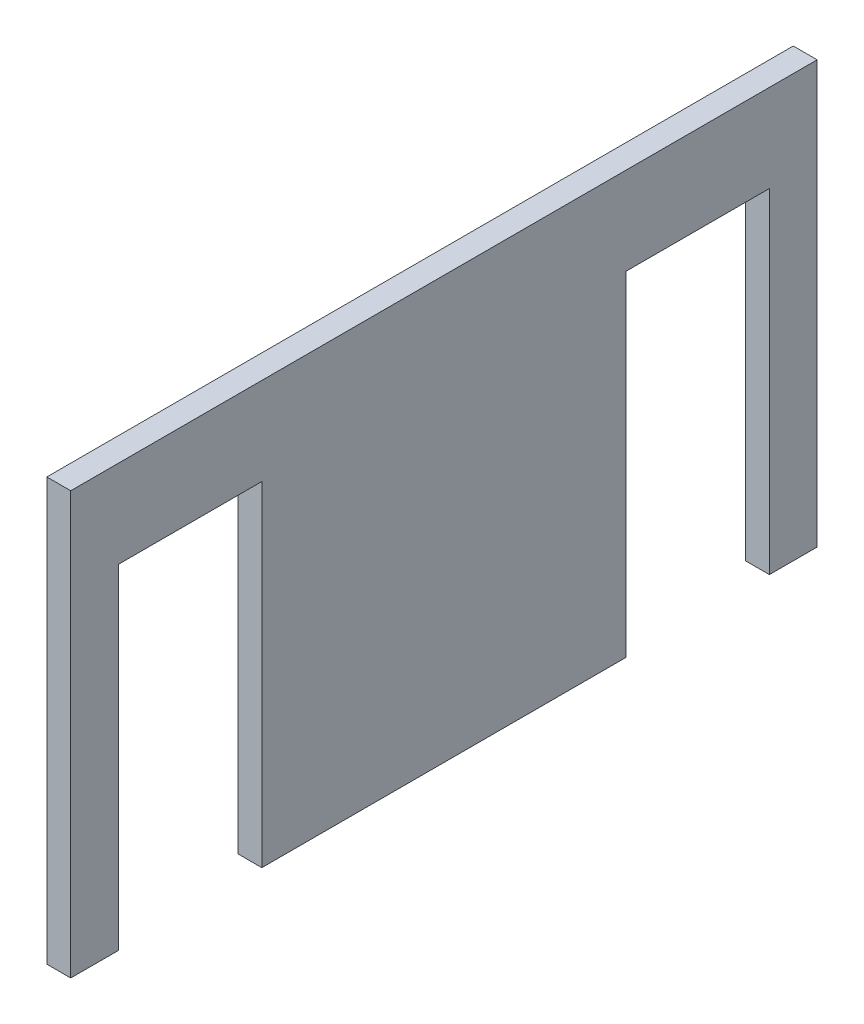
ISO-10303-21;
HEADER;
FILE_DESCRIPTION(('STEP AP214'),'2;1');
FILE_NAME('part.step','',(''),(''),'','','');
FILE_SCHEMA(('AUTOMOTIVE_DESIGN { 1 0 10303 214 1 1 1 1 }'));
ENDSEC;
DATA;
#1=APPLICATION_CONTEXT('core data for automotive mechanical design processes');
#2=APPLICATION_PROTOCOL_DEFINITION('international standard','automotive_design',2000,#1);
#3=PRODUCT_CONTEXT('',#1,'mechanical');
#4=PRODUCT('Part','Part','',(#3));
#5=PRODUCT_RELATED_PRODUCT_CATEGORY('part','',(#4));
#6=PRODUCT_DEFINITION_FORMATION('','',#4);
#7=PRODUCT_DEFINITION_CONTEXT('part definition',#1,'design');
#8=PRODUCT_DEFINITION('design','',#6,#7);
#9=PRODUCT_DEFINITION_SHAPE('','',#8);
#10=(LENGTH_UNIT() NAMED_UNIT(*) SI_UNIT(.MILLI.,.METRE.));
#11=(NAMED_UNIT(*) PLANE_ANGLE_UNIT() SI_UNIT($,.RADIAN.));
#12=(NAMED_UNIT(*) SI_UNIT($,.STERADIAN.) SOLID_ANGLE_UNIT());
#13=UNCERTAINTY_MEASURE_WITH_UNIT(LENGTH_MEASURE(1.E-05),#10,'distance_accuracy_value','');
#14=(GEOMETRIC_REPRESENTATION_CONTEXT(3) GLOBAL_UNCERTAINTY_ASSIGNED_CONTEXT((#13)) GLOBAL_UNIT_ASSIGNED_CONTEXT((#10,
#11,#12)) REPRESENTATION_CONTEXT('',''));
#15=CARTESIAN_POINT('',(0.,0.,0.));
#16=DIRECTION('',(0.,0.,1.));
#17=DIRECTION('',(1.,0.,0.));
#18=AXIS2_PLACEMENT_3D('',#15,#16,#17);
#19=CARTESIAN_POINT('',(0.,0.,0.));
#20=DIRECTION('',(0.,-1.,0.));
#21=DIRECTION('',(0.,0.,-1.));
#22=AXIS2_PLACEMENT_3D('',#19,#20,#21);
#23=PLANE('',#22);
#24=DIRECTION('',(0.,0.,1.));
#25=VECTOR('',#24,1.);
#26=CARTESIAN_POINT('',(-76.2000000000003,0.,2381.25));
#27=LINE('',#26,#25);
#28=CARTESIAN_POINT('',(-76.2000000000003,0.,-1162.05));
#29=VERTEX_POINT('',#28);
#30=CARTESIAN_POINT('',(-76.2000000000003,0.,1162.05));
#31=VERTEX_POINT('',#30);
#32=EDGE_CURVE('E142',#29,#31,#27,.T.);
#33=ORIENTED_EDGE('',*,*,#32,.F.);
#34=DIRECTION('',(1.,0.,0.));
#35=VECTOR('',#34,1.);
#36=CARTESIAN_POINT('',(-76.2000000000003,0.,-1162.05));
#37=LINE('',#36,#35);
#38=CARTESIAN_POINT('',(76.1999999999998,0.,-1162.05));
#39=VERTEX_POINT('',#38);
#40=EDGE_CURVE('E123',#29,#39,#37,.T.);
#41=ORIENTED_EDGE('',*,*,#40,.T.);
#42=DIRECTION('',(0.,0.,-1.));
#43=VECTOR('',#42,1.);
#44=CARTESIAN_POINT('',(76.1999999999998,0.,2381.25));
#45=LINE('',#44,#43);
#46=CARTESIAN_POINT('',(76.1999999999998,0.,1162.05));
#47=VERTEX_POINT('',#46);
#48=EDGE_CURVE('E215',#47,#39,#45,.T.);
#49=ORIENTED_EDGE('',*,*,#48,.F.);
#50=DIRECTION('',(1.,0.,0.));
#51=VECTOR('',#50,1.);
#52=CARTESIAN_POINT('',(-76.2000000000003,0.,1162.05));
#53=LINE('',#52,#51);
#54=EDGE_CURVE('E149',#31,#47,#53,.T.);
#55=ORIENTED_EDGE('',*,*,#54,.F.);
#56=EDGE_LOOP('',(#33,#41,#49,#55));
#57=FACE_BOUND('',#56,.T.);
#58=ADVANCED_FACE('F35',(#57),#23,.T.);
#59=CARTESIAN_POINT('',(76.1999999999998,0.,-2076.45));
#60=VERTEX_POINT('',#59);
#61=CARTESIAN_POINT('',(76.1999999999998,0.,-2381.25));
#62=VERTEX_POINT('',#61);
#63=EDGE_CURVE('E179',#60,#62,#45,.T.);
#64=ORIENTED_EDGE('',*,*,#63,.F.);
#65=DIRECTION('',(1.,0.,0.));
#66=VECTOR('',#65,1.);
#67=CARTESIAN_POINT('',(-76.2000000000003,0.,-2076.45));
#68=LINE('',#67,#66);
#69=CARTESIAN_POINT('',(-76.2000000000003,0.,-2076.45));
#70=VERTEX_POINT('',#69);
#71=EDGE_CURVE('E135',#70,#60,#68,.T.);
#72=ORIENTED_EDGE('',*,*,#71,.F.);
#73=CARTESIAN_POINT('',(-76.2000000000003,0.,-2381.25));
#74=VERTEX_POINT('',#73);
#75=EDGE_CURVE('E150',#74,#70,#27,.T.);
#76=ORIENTED_EDGE('',*,*,#75,.F.);
#77=DIRECTION('',(-1.,0.,0.));
#78=VECTOR('',#77,1.);
#79=CARTESIAN_POINT('',(-76.2000000000003,0.,-2381.25));
#80=LINE('',#79,#78);
#81=EDGE_CURVE('E155',#62,#74,#80,.T.);
#82=ORIENTED_EDGE('',*,*,#81,.F.);
#83=EDGE_LOOP('',(#64,#72,#76,#82));
#84=FACE_BOUND('',#83,.T.);
#85=ADVANCED_FACE('F178',(#84),#23,.T.);
#86=CARTESIAN_POINT('',(76.1999999999998,2692.4,2381.25));
#87=DIRECTION('',(-1.,0.,0.));
#88=DIRECTION('',(0.,0.,1.));
#89=AXIS2_PLACEMENT_3D('',#86,#87,#88);
#90=PLANE('',#89);
#91=DIRECTION('',(0.,1.,0.));
#92=VECTOR('',#91,1.);
#93=CARTESIAN_POINT('',(76.1999999999998,2133.6,-1162.05));
#94=LINE('',#93,#92);
#95=CARTESIAN_POINT('',(76.1999999999998,2133.6,-1162.05));
#96=VERTEX_POINT('',#95);
#97=EDGE_CURVE('E130',#39,#96,#94,.T.);
#98=ORIENTED_EDGE('',*,*,#97,.T.);
#99=DIRECTION('',(0.,0.,-1.));
#100=VECTOR('',#99,1.);
#101=CARTESIAN_POINT('',(76.1999999999998,2133.6,-2076.45));
#102=LINE('',#101,#100);
#103=CARTESIAN_POINT('',(76.1999999999998,2133.6,-2076.45));
#104=VERTEX_POINT('',#103);
#105=EDGE_CURVE('E146',#96,#104,#102,.T.);
#106=ORIENTED_EDGE('',*,*,#105,.T.);
#107=DIRECTION('',(0.,-1.,0.));
#108=VECTOR('',#107,1.);
#109=CARTESIAN_POINT('',(76.1999999999998,2133.6,-2076.45));
#110=LINE('',#109,#108);
#111=EDGE_CURVE('E221',#104,#60,#110,.T.);
#112=ORIENTED_EDGE('',*,*,#111,.T.);
#113=ORIENTED_EDGE('',*,*,#63,.T.);
#114=DIRECTION('',(0.,-1.,0.));
#115=VECTOR('',#114,1.);
#116=CARTESIAN_POINT('',(76.1999999999998,2692.4,-2381.25));
#117=LINE('',#116,#115);
#118=CARTESIAN_POINT('',(76.1999999999998,2692.4,-2381.25));
#119=VERTEX_POINT('',#118);
#120=EDGE_CURVE('E11',#119,#62,#117,.T.);
#121=ORIENTED_EDGE('',*,*,#120,.F.);
#122=DIRECTION('',(0.,0.,-1.));
#123=VECTOR('',#122,1.);
#124=CARTESIAN_POINT('',(76.1999999999998,2692.4,2381.25));
#125=LINE('',#124,#123);
#126=CARTESIAN_POINT('',(76.1999999999998,2692.4,2381.25));
#127=VERTEX_POINT('',#126);
#128=EDGE_CURVE('E160',#127,#119,#125,.T.);
#129=ORIENTED_EDGE('',*,*,#128,.F.);
#130=DIRECTION('',(0.,-1.,0.));
#131=VECTOR('',#130,1.);
#132=CARTESIAN_POINT('',(76.1999999999998,2692.4,2381.25));
#133=LINE('',#132,#131);
#134=CARTESIAN_POINT('',(76.1999999999998,0.,2381.25));
#135=VERTEX_POINT('',#134);
#136=EDGE_CURVE('E161',#127,#135,#133,.T.);
#137=ORIENTED_EDGE('',*,*,#136,.T.);
#138=CARTESIAN_POINT('',(76.1999999999998,0.,2076.45));
#139=VERTEX_POINT('',#138);
#140=EDGE_CURVE('E213',#135,#139,#45,.T.);
#141=ORIENTED_EDGE('',*,*,#140,.T.);
#142=DIRECTION('',(0.,-1.,0.));
#143=VECTOR('',#142,1.);
#144=CARTESIAN_POINT('',(76.1999999999998,2133.6,2076.45));
#145=LINE('',#144,#143);
#146=CARTESIAN_POINT('',(76.1999999999998,2133.6,2076.45));
#147=VERTEX_POINT('',#146);
#148=EDGE_CURVE('E58',#147,#139,#145,.T.);
#149=ORIENTED_EDGE('',*,*,#148,.F.);
#150=DIRECTION('',(0.,0.,1.));
#151=VECTOR('',#150,1.);
#152=CARTESIAN_POINT('',(76.1999999999998,2133.6,2076.45));
#153=LINE('',#152,#151);
#154=CARTESIAN_POINT('',(76.1999999999998,2133.6,1162.05));
#155=VERTEX_POINT('',#154);
#156=EDGE_CURVE('E198',#155,#147,#153,.T.);
#157=ORIENTED_EDGE('',*,*,#156,.F.);
#158=DIRECTION('',(0.,1.,0.));
#159=VECTOR('',#158,1.);
#160=CARTESIAN_POINT('',(76.1999999999998,2133.6,1162.05));
#161=LINE('',#160,#159);
#162=EDGE_CURVE('E195',#47,#155,#161,.T.);
#163=ORIENTED_EDGE('',*,*,#162,.F.);
#164=ORIENTED_EDGE('',*,*,#48,.T.);
#165=EDGE_LOOP('',(#98,#106,#112,#113,#121,#129,#137,#141,#149,#157,#163,#164));
#166=FACE_BOUND('',#165,.T.);
#167=ADVANCED_FACE('F37',(#166),#90,.F.);
#168=CARTESIAN_POINT('',(-76.2000000000003,2692.4,2381.25));
#169=DIRECTION('',(1.,0.,0.));
#170=DIRECTION('',(0.,0.,-1.));
#171=AXIS2_PLACEMENT_3D('',#168,#169,#170);
#172=PLANE('',#171);
#173=DIRECTION('',(0.,1.,0.));
#174=VECTOR('',#173,1.);
#175=CARTESIAN_POINT('',(-76.2000000000003,2133.6,-1162.05));
#176=LINE('',#175,#174);
#177=CARTESIAN_POINT('',(-76.2000000000003,2133.6,-1162.05));
#178=VERTEX_POINT('',#177);
#179=EDGE_CURVE('E127',#29,#178,#176,.T.);
#180=ORIENTED_EDGE('',*,*,#179,.F.);
#181=ORIENTED_EDGE('',*,*,#32,.T.);
#182=DIRECTION('',(0.,1.,0.));
#183=VECTOR('',#182,1.);
#184=CARTESIAN_POINT('',(-76.2000000000003,2133.6,1162.05));
#185=LINE('',#184,#183);
#186=CARTESIAN_POINT('',(-76.2000000000003,2133.6,1162.05));
#187=VERTEX_POINT('',#186);
#188=EDGE_CURVE('E186',#31,#187,#185,.T.);
#189=ORIENTED_EDGE('',*,*,#188,.T.);
#190=DIRECTION('',(0.,0.,1.));
#191=VECTOR('',#190,1.);
#192=CARTESIAN_POINT('',(-76.2000000000003,2133.6,2076.45));
#193=LINE('',#192,#191);
#194=CARTESIAN_POINT('',(-76.2000000000003,2133.6,2076.45));
#195=VERTEX_POINT('',#194);
#196=EDGE_CURVE('E188',#187,#195,#193,.T.);
#197=ORIENTED_EDGE('',*,*,#196,.T.);
#198=DIRECTION('',(0.,-1.,0.));
#199=VECTOR('',#198,1.);
#200=CARTESIAN_POINT('',(-76.2000000000003,2133.6,2076.45));
#201=LINE('',#200,#199);
#202=CARTESIAN_POINT('',(-76.2000000000003,0.,2076.45));
#203=VERTEX_POINT('',#202);
#204=EDGE_CURVE('E191',#195,#203,#201,.T.);
#205=ORIENTED_EDGE('',*,*,#204,.T.);
#206=CARTESIAN_POINT('',(-76.2000000000003,0.,2381.25));
#207=VERTEX_POINT('',#206);
#208=EDGE_CURVE('E151',#203,#207,#27,.T.);
#209=ORIENTED_EDGE('',*,*,#208,.T.);
#210=DIRECTION('',(0.,-1.,0.));
#211=VECTOR('',#210,1.);
#212=CARTESIAN_POINT('',(-76.2000000000003,2692.4,2381.25));
#213=LINE('',#212,#211);
#214=CARTESIAN_POINT('',(-76.2000000000003,2692.4,2381.25));
#215=VERTEX_POINT('',#214);
#216=EDGE_CURVE('E164',#215,#207,#213,.T.);
#217=ORIENTED_EDGE('',*,*,#216,.F.);
#218=DIRECTION('',(0.,0.,1.));
#219=VECTOR('',#218,1.);
#220=CARTESIAN_POINT('',(-76.2000000000003,2692.4,2381.25));
#221=LINE('',#220,#219);
#222=CARTESIAN_POINT('',(-76.2000000000003,2692.4,-2381.25));
#223=VERTEX_POINT('',#222);
#224=EDGE_CURVE('E172',#223,#215,#221,.T.);
#225=ORIENTED_EDGE('',*,*,#224,.F.);
#226=DIRECTION('',(0.,-1.,0.));
#227=VECTOR('',#226,1.);
#228=CARTESIAN_POINT('',(-76.2000000000003,2692.4,-2381.25));
#229=LINE('',#228,#227);
#230=EDGE_CURVE('E43',#223,#74,#229,.T.);
#231=ORIENTED_EDGE('',*,*,#230,.T.);
#232=ORIENTED_EDGE('',*,*,#75,.T.);
#233=DIRECTION('',(0.,-1.,0.));
#234=VECTOR('',#233,1.);
#235=CARTESIAN_POINT('',(-76.2000000000003,2133.6,-2076.45));
#236=LINE('',#235,#234);
#237=CARTESIAN_POINT('',(-76.2000000000003,2133.6,-2076.45));
#238=VERTEX_POINT('',#237);
#239=EDGE_CURVE('E145',#238,#70,#236,.T.);
#240=ORIENTED_EDGE('',*,*,#239,.F.);
#241=DIRECTION('',(0.,0.,-1.));
#242=VECTOR('',#241,1.);
#243=CARTESIAN_POINT('',(-76.2000000000003,2133.6,-2076.45));
#244=LINE('',#243,#242);
#245=EDGE_CURVE('E136',#178,#238,#244,.T.);
#246=ORIENTED_EDGE('',*,*,#245,.F.);
#247=EDGE_LOOP('',(#180,#181,#189,#197,#205,#209,#217,#225,#231,#232,#240,#246));
#248=FACE_BOUND('',#247,.T.);
#249=ADVANCED_FACE('F140',(#248),#172,.F.);
#250=CARTESIAN_POINT('',(-76.2000000000003,2692.4,-2381.25));
#251=DIRECTION('',(0.,0.,1.));
#252=DIRECTION('',(1.,0.,0.));
#253=AXIS2_PLACEMENT_3D('',#250,#251,#252);
#254=PLANE('',#253);
#255=ORIENTED_EDGE('',*,*,#81,.T.);
#256=ORIENTED_EDGE('',*,*,#230,.F.);
#257=DIRECTION('',(-1.,0.,0.));
#258=VECTOR('',#257,1.);
#259=CARTESIAN_POINT('',(-76.2000000000003,2692.4,-2381.25));
#260=LINE('',#259,#258);
#261=EDGE_CURVE('E210',#119,#223,#260,.T.);
#262=ORIENTED_EDGE('',*,*,#261,.F.);
#263=ORIENTED_EDGE('',*,*,#120,.T.);
#264=EDGE_LOOP('',(#255,#256,#262,#263));
#265=FACE_BOUND('',#264,.T.);
#266=ADVANCED_FACE('F246',(#265),#254,.F.);
#267=CARTESIAN_POINT('',(-76.2000000000003,2692.4,2381.25));
#268=DIRECTION('',(0.,0.,-1.));
#269=DIRECTION('',(-1.,0.,0.));
#270=AXIS2_PLACEMENT_3D('',#267,#268,#269);
#271=PLANE('',#270);
#272=DIRECTION('',(1.,0.,0.));
#273=VECTOR('',#272,1.);
#274=CARTESIAN_POINT('',(-76.2000000000003,0.,2381.25));
#275=LINE('',#274,#273);
#276=EDGE_CURVE('E154',#207,#135,#275,.T.);
#277=ORIENTED_EDGE('',*,*,#276,.T.);
#278=ORIENTED_EDGE('',*,*,#136,.F.);
#279=DIRECTION('',(1.,0.,0.));
#280=VECTOR('',#279,1.);
#281=CARTESIAN_POINT('',(-76.2000000000003,2692.4,2381.25));
#282=LINE('',#281,#280);
#283=EDGE_CURVE('E165',#215,#127,#282,.T.);
#284=ORIENTED_EDGE('',*,*,#283,.F.);
#285=ORIENTED_EDGE('',*,*,#216,.T.);
#286=EDGE_LOOP('',(#277,#278,#284,#285));
#287=FACE_BOUND('',#286,.T.);
#288=ADVANCED_FACE('F242',(#287),#271,.F.);
#289=CARTESIAN_POINT('',(0.,2692.4,0.));
#290=DIRECTION('',(0.,-1.,0.));
#291=DIRECTION('',(0.,0.,-1.));
#292=AXIS2_PLACEMENT_3D('',#289,#290,#291);
#293=PLANE('',#292);
#294=ORIENTED_EDGE('',*,*,#128,.T.);
#295=ORIENTED_EDGE('',*,*,#261,.T.);
#296=ORIENTED_EDGE('',*,*,#224,.T.);
#297=ORIENTED_EDGE('',*,*,#283,.T.);
#298=EDGE_LOOP('',(#294,#295,#296,#297));
#299=FACE_BOUND('',#298,.T.);
#300=ADVANCED_FACE('F245',(#299),#293,.F.);
#301=DIRECTION('',(1.,0.,0.));
#302=VECTOR('',#301,1.);
#303=CARTESIAN_POINT('',(-76.2000000000003,0.,2076.45));
#304=LINE('',#303,#302);
#305=EDGE_CURVE('E203',#203,#139,#304,.T.);
#306=ORIENTED_EDGE('',*,*,#305,.T.);
#307=ORIENTED_EDGE('',*,*,#140,.F.);
#308=ORIENTED_EDGE('',*,*,#276,.F.);
#309=ORIENTED_EDGE('',*,*,#208,.F.);
#310=EDGE_LOOP('',(#306,#307,#308,#309));
#311=FACE_BOUND('',#310,.T.);
#312=ADVANCED_FACE('F238',(#311),#23,.T.);
#313=CARTESIAN_POINT('',(-76.2000000000003,2133.6,1162.05));
#314=DIRECTION('',(0.,0.,-1.));
#315=DIRECTION('',(0.,1.,0.));
#316=AXIS2_PLACEMENT_3D('',#313,#314,#315);
#317=PLANE('',#316);
#318=ORIENTED_EDGE('',*,*,#162,.T.);
#319=DIRECTION('',(1.,0.,0.));
#320=VECTOR('',#319,1.);
#321=CARTESIAN_POINT('',(-76.2000000000003,2133.6,1162.05));
#322=LINE('',#321,#320);
#323=EDGE_CURVE('E194',#187,#155,#322,.T.);
#324=ORIENTED_EDGE('',*,*,#323,.F.);
#325=ORIENTED_EDGE('',*,*,#188,.F.);
#326=ORIENTED_EDGE('',*,*,#54,.T.);
#327=EDGE_LOOP('',(#318,#324,#325,#326));
#328=FACE_BOUND('',#327,.T.);
#329=ADVANCED_FACE('F230',(#328),#317,.F.);
#330=CARTESIAN_POINT('',(-76.2000000000003,2133.6,2076.45));
#331=DIRECTION('',(0.,0.,1.));
#332=DIRECTION('',(0.,-1.,0.));
#333=AXIS2_PLACEMENT_3D('',#330,#331,#332);
#334=PLANE('',#333);
#335=ORIENTED_EDGE('',*,*,#148,.T.);
#336=ORIENTED_EDGE('',*,*,#305,.F.);
#337=ORIENTED_EDGE('',*,*,#204,.F.);
#338=DIRECTION('',(1.,0.,0.));
#339=VECTOR('',#338,1.);
#340=CARTESIAN_POINT('',(-76.2000000000003,2133.6,2076.45));
#341=LINE('',#340,#339);
#342=EDGE_CURVE('E205',#195,#147,#341,.T.);
#343=ORIENTED_EDGE('',*,*,#342,.T.);
#344=EDGE_LOOP('',(#335,#336,#337,#343));
#345=FACE_BOUND('',#344,.T.);
#346=ADVANCED_FACE('F236',(#345),#334,.F.);
#347=CARTESIAN_POINT('',(-76.2000000000003,2133.6,2076.45));
#348=DIRECTION('',(0.,1.,0.));
#349=DIRECTION('',(0.,0.,1.));
#350=AXIS2_PLACEMENT_3D('',#347,#348,#349);
#351=PLANE('',#350);
#352=ORIENTED_EDGE('',*,*,#156,.T.);
#353=ORIENTED_EDGE('',*,*,#342,.F.);
#354=ORIENTED_EDGE('',*,*,#196,.F.);
#355=ORIENTED_EDGE('',*,*,#323,.T.);
#356=EDGE_LOOP('',(#352,#353,#354,#355));
#357=FACE_BOUND('',#356,.T.);
#358=ADVANCED_FACE('F235',(#357),#351,.F.);
#359=CARTESIAN_POINT('',(-76.2000000000003,2133.6,-1162.05));
#360=DIRECTION('',(0.,0.,-1.));
#361=DIRECTION('',(0.,1.,0.));
#362=AXIS2_PLACEMENT_3D('',#359,#360,#361);
#363=PLANE('',#362);
#364=ORIENTED_EDGE('',*,*,#97,.F.);
#365=ORIENTED_EDGE('',*,*,#40,.F.);
#366=ORIENTED_EDGE('',*,*,#179,.T.);
#367=DIRECTION('',(1.,0.,0.));
#368=VECTOR('',#367,1.);
#369=CARTESIAN_POINT('',(-76.2000000000003,2133.6,-1162.05));
#370=LINE('',#369,#368);
#371=EDGE_CURVE('E182',#178,#96,#370,.T.);
#372=ORIENTED_EDGE('',*,*,#371,.T.);
#373=EDGE_LOOP('',(#364,#365,#366,#372));
#374=FACE_BOUND('',#373,.T.);
#375=ADVANCED_FACE('F125',(#374),#363,.T.);
#376=CARTESIAN_POINT('',(-76.2000000000003,2133.6,-2076.45));
#377=DIRECTION('',(0.,-1.,0.));
#378=DIRECTION('',(0.,0.,-1.));
#379=AXIS2_PLACEMENT_3D('',#376,#377,#378);
#380=PLANE('',#379);
#381=ORIENTED_EDGE('',*,*,#105,.F.);
#382=ORIENTED_EDGE('',*,*,#371,.F.);
#383=ORIENTED_EDGE('',*,*,#245,.T.);
#384=DIRECTION('',(1.,0.,0.));
#385=VECTOR('',#384,1.);
#386=CARTESIAN_POINT('',(-76.2000000000003,2133.6,-2076.45));
#387=LINE('',#386,#385);
#388=EDGE_CURVE('E50',#238,#104,#387,.T.);
#389=ORIENTED_EDGE('',*,*,#388,.T.);
#390=EDGE_LOOP('',(#381,#382,#383,#389));
#391=FACE_BOUND('',#390,.T.);
#392=ADVANCED_FACE('F277',(#391),#380,.T.);
#393=CARTESIAN_POINT('',(-76.2000000000003,2133.6,-2076.45));
#394=DIRECTION('',(0.,0.,1.));
#395=DIRECTION('',(0.,-1.,0.));
#396=AXIS2_PLACEMENT_3D('',#393,#394,#395);
#397=PLANE('',#396);
#398=ORIENTED_EDGE('',*,*,#111,.F.);
#399=ORIENTED_EDGE('',*,*,#388,.F.);
#400=ORIENTED_EDGE('',*,*,#239,.T.);
#401=ORIENTED_EDGE('',*,*,#71,.T.);
#402=EDGE_LOOP('',(#398,#399,#400,#401));
#403=FACE_BOUND('',#402,.T.);
#404=ADVANCED_FACE('F278',(#403),#397,.T.);
#405=CLOSED_SHELL('',(#58,#85,#167,#249,#266,#288,#300,#312,#329,#346,#358,#375,#392,#404));
#406=MANIFOLD_SOLID_BREP('B2',#405);
#407=ADVANCED_BREP_SHAPE_REPRESENTATION('',(#18,#406),#14);
#408=SHAPE_DEFINITION_REPRESENTATION(#9,#407);
ENDSEC;
END-ISO-10303-21;
